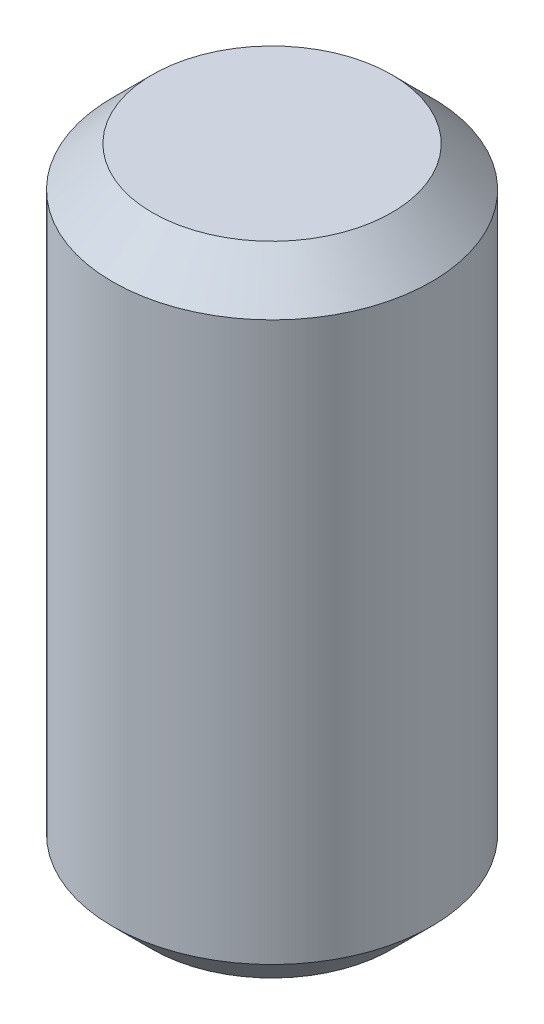
ISO-10303-21;
HEADER;
FILE_DESCRIPTION(('STEP AP214'),'2;1');
FILE_NAME('part.step','',(''),(''),'','','');
FILE_SCHEMA(('AUTOMOTIVE_DESIGN { 1 0 10303 214 1 1 1 1 }'));
ENDSEC;
DATA;
#1=APPLICATION_CONTEXT('core data for automotive mechanical design processes');
#2=APPLICATION_PROTOCOL_DEFINITION('international standard','automotive_design',2000,#1);
#3=PRODUCT_CONTEXT('',#1,'mechanical');
#4=PRODUCT('Part','Part','',(#3));
#5=PRODUCT_RELATED_PRODUCT_CATEGORY('part','',(#4));
#6=PRODUCT_DEFINITION_FORMATION('','',#4);
#7=PRODUCT_DEFINITION_CONTEXT('part definition',#1,'design');
#8=PRODUCT_DEFINITION('design','',#6,#7);
#9=PRODUCT_DEFINITION_SHAPE('','',#8);
#10=(LENGTH_UNIT() NAMED_UNIT(*) SI_UNIT(.MILLI.,.METRE.));
#11=(NAMED_UNIT(*) PLANE_ANGLE_UNIT() SI_UNIT($,.RADIAN.));
#12=(NAMED_UNIT(*) SI_UNIT($,.STERADIAN.) SOLID_ANGLE_UNIT());
#13=UNCERTAINTY_MEASURE_WITH_UNIT(LENGTH_MEASURE(1.E-05),#10,'distance_accuracy_value','');
#14=(GEOMETRIC_REPRESENTATION_CONTEXT(3) GLOBAL_UNCERTAINTY_ASSIGNED_CONTEXT((#13)) GLOBAL_UNIT_ASSIGNED_CONTEXT((#10,
#11,#12)) REPRESENTATION_CONTEXT('',''));
#15=CARTESIAN_POINT('',(0.,0.,0.));
#16=DIRECTION('',(0.,0.,1.));
#17=DIRECTION('',(1.,0.,0.));
#18=AXIS2_PLACEMENT_3D('',#15,#16,#17);
#19=CARTESIAN_POINT('',(0.,8.,0.));
#20=DIRECTION('',(0.,-1.,0.));
#21=DIRECTION('',(0.,0.,-1.));
#22=AXIS2_PLACEMENT_3D('',#19,#20,#21);
#23=CYLINDRICAL_SURFACE('',#22,2.);
#24=CARTESIAN_POINT('',(0.,7.5,0.));
#25=DIRECTION('',(0.,1.,0.));
#26=DIRECTION('',(0.,0.,1.));
#27=AXIS2_PLACEMENT_3D('',#24,#25,#26);
#28=CIRCLE('',#27,2.);
#29=CARTESIAN_POINT('',(0.,7.5,2.));
#30=VERTEX_POINT('',#29);
#31=EDGE_CURVE('E38',#30,#30,#28,.F.);
#32=ORIENTED_EDGE('',*,*,#31,.T.);
#33=EDGE_LOOP('',(#32));
#34=FACE_BOUND('',#33,.T.);
#35=CARTESIAN_POINT('',(0.,0.5,0.));
#36=DIRECTION('',(0.,1.,0.));
#37=DIRECTION('',(0.,0.,1.));
#38=AXIS2_PLACEMENT_3D('',#35,#36,#37);
#39=CIRCLE('',#38,2.);
#40=CARTESIAN_POINT('',(0.,0.5,2.));
#41=VERTEX_POINT('',#40);
#42=EDGE_CURVE('E42',#41,#41,#39,.T.);
#43=ORIENTED_EDGE('',*,*,#42,.T.);
#44=EDGE_LOOP('',(#43));
#45=FACE_BOUND('',#44,.T.);
#46=ADVANCED_FACE('F31',(#34,#45),#23,.T.);
#47=CARTESIAN_POINT('',(0.,8.,0.));
#48=DIRECTION('',(0.,1.,0.));
#49=DIRECTION('',(0.,0.,1.));
#50=AXIS2_PLACEMENT_3D('',#47,#48,#49);
#51=PLANE('',#50);
#52=CARTESIAN_POINT('',(0.,8.,0.));
#53=DIRECTION('',(0.,1.,0.));
#54=DIRECTION('',(0.,0.,1.));
#55=AXIS2_PLACEMENT_3D('',#52,#53,#54);
#56=CIRCLE('',#55,1.5);
#57=CARTESIAN_POINT('',(0.,8.,1.5));
#58=VERTEX_POINT('',#57);
#59=EDGE_CURVE('E46',#58,#58,#56,.T.);
#60=ORIENTED_EDGE('',*,*,#59,.T.);
#61=EDGE_LOOP('',(#60));
#62=FACE_BOUND('',#61,.T.);
#63=ADVANCED_FACE('F52',(#62),#51,.T.);
#64=CARTESIAN_POINT('',(0.,0.,0.));
#65=DIRECTION('',(0.,1.,0.));
#66=DIRECTION('',(0.,0.,1.));
#67=AXIS2_PLACEMENT_3D('',#64,#65,#66);
#68=PLANE('',#67);
#69=CARTESIAN_POINT('',(0.,0.,0.));
#70=DIRECTION('',(0.,1.,0.));
#71=DIRECTION('',(0.,0.,1.));
#72=AXIS2_PLACEMENT_3D('',#69,#70,#71);
#73=CIRCLE('',#72,1.5);
#74=CARTESIAN_POINT('',(0.,0.,1.5));
#75=VERTEX_POINT('',#74);
#76=EDGE_CURVE('E10',#75,#75,#73,.F.);
#77=ORIENTED_EDGE('',*,*,#76,.T.);
#78=EDGE_LOOP('',(#77));
#79=FACE_BOUND('',#78,.T.);
#80=ADVANCED_FACE('F56',(#79),#68,.F.);
#81=CARTESIAN_POINT('',(0.,8.,0.));
#82=DIRECTION('',(0.,-1.,0.));
#83=DIRECTION('',(0.,0.,-1.));
#84=AXIS2_PLACEMENT_3D('',#81,#82,#83);
#85=CONICAL_SURFACE('',#84,1.5,0.785398163397446);
#86=ORIENTED_EDGE('',*,*,#31,.F.);
#87=EDGE_LOOP('',(#86));
#88=FACE_BOUND('',#87,.T.);
#89=ORIENTED_EDGE('',*,*,#59,.F.);
#90=EDGE_LOOP('',(#89));
#91=FACE_BOUND('',#90,.T.);
#92=ADVANCED_FACE('F54',(#88,#91),#85,.T.);
#93=CARTESIAN_POINT('',(0.,0.5,0.));
#94=DIRECTION('',(0.,1.,0.));
#95=DIRECTION('',(0.,0.,1.));
#96=AXIS2_PLACEMENT_3D('',#93,#94,#95);
#97=CONICAL_SURFACE('',#96,2.,0.78539816339745);
#98=ORIENTED_EDGE('',*,*,#76,.F.);
#99=EDGE_LOOP('',(#98));
#100=FACE_BOUND('',#99,.T.);
#101=ORIENTED_EDGE('',*,*,#42,.F.);
#102=EDGE_LOOP('',(#101));
#103=FACE_BOUND('',#102,.T.);
#104=ADVANCED_FACE('F33',(#100,#103),#97,.T.);
#105=CLOSED_SHELL('',(#46,#63,#80,#92,#104));
#106=MANIFOLD_SOLID_BREP('B2',#105);
#107=ADVANCED_BREP_SHAPE_REPRESENTATION('',(#18,#106),#14);
#108=SHAPE_DEFINITION_REPRESENTATION(#9,#107);
ENDSEC;
END-ISO-10303-21;
